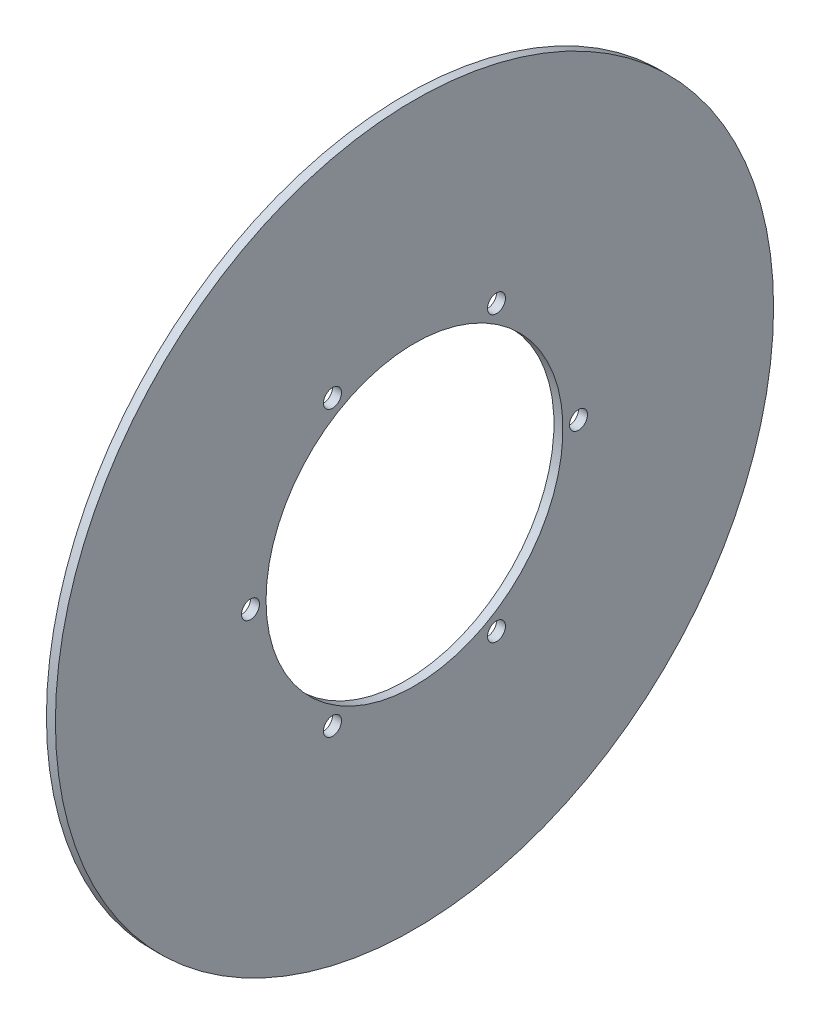
ISO-10303-21;
HEADER;
FILE_DESCRIPTION(('STEP AP214'),'2;1');
FILE_NAME('part.step','',(''),(''),'','','');
FILE_SCHEMA(('AUTOMOTIVE_DESIGN { 1 0 10303 214 1 1 1 1 }'));
ENDSEC;
DATA;
#1=APPLICATION_CONTEXT('core data for automotive mechanical design processes');
#2=APPLICATION_PROTOCOL_DEFINITION('international standard','automotive_design',2000,#1);
#3=PRODUCT_CONTEXT('',#1,'mechanical');
#4=PRODUCT('Part','Part','',(#3));
#5=PRODUCT_RELATED_PRODUCT_CATEGORY('part','',(#4));
#6=PRODUCT_DEFINITION_FORMATION('','',#4);
#7=PRODUCT_DEFINITION_CONTEXT('part definition',#1,'design');
#8=PRODUCT_DEFINITION('design','',#6,#7);
#9=PRODUCT_DEFINITION_SHAPE('','',#8);
#10=(LENGTH_UNIT() NAMED_UNIT(*) SI_UNIT(.MILLI.,.METRE.));
#11=(NAMED_UNIT(*) PLANE_ANGLE_UNIT() SI_UNIT($,.RADIAN.));
#12=(NAMED_UNIT(*) SI_UNIT($,.STERADIAN.) SOLID_ANGLE_UNIT());
#13=UNCERTAINTY_MEASURE_WITH_UNIT(LENGTH_MEASURE(1.E-05),#10,'distance_accuracy_value','');
#14=(GEOMETRIC_REPRESENTATION_CONTEXT(3) GLOBAL_UNCERTAINTY_ASSIGNED_CONTEXT((#13)) GLOBAL_UNIT_ASSIGNED_CONTEXT((#10,
#11,#12)) REPRESENTATION_CONTEXT('',''));
#15=CARTESIAN_POINT('',(0.,0.,0.));
#16=DIRECTION('',(0.,0.,1.));
#17=DIRECTION('',(1.,0.,0.));
#18=AXIS2_PLACEMENT_3D('',#15,#16,#17);
#19=CARTESIAN_POINT('',(-3.175,0.,-58.));
#20=DIRECTION('',(1.,0.,0.));
#21=DIRECTION('',(0.,0.,-1.));
#22=AXIS2_PLACEMENT_3D('',#19,#20,#21);
#23=CYLINDRICAL_SURFACE('',#22,3.175);
#24=CARTESIAN_POINT('',(-3.175,0.,-58.));
#25=DIRECTION('',(-1.,0.,0.));
#26=DIRECTION('',(0.,0.,1.));
#27=AXIS2_PLACEMENT_3D('',#24,#25,#26);
#28=CIRCLE('',#27,3.175);
#29=CARTESIAN_POINT('',(-3.175,0.,-54.825));
#30=VERTEX_POINT('',#29);
#31=EDGE_CURVE('E49',#30,#30,#28,.T.);
#32=ORIENTED_EDGE('',*,*,#31,.T.);
#33=EDGE_LOOP('',(#32));
#34=FACE_BOUND('',#33,.T.);
#35=CARTESIAN_POINT('',(0.,0.,-58.));
#36=DIRECTION('',(-1.,0.,0.));
#37=DIRECTION('',(0.,0.,1.));
#38=AXIS2_PLACEMENT_3D('',#35,#36,#37);
#39=CIRCLE('',#38,3.175);
#40=CARTESIAN_POINT('',(0.,0.,-54.825));
#41=VERTEX_POINT('',#40);
#42=EDGE_CURVE('E75',#41,#41,#39,.T.);
#43=ORIENTED_EDGE('',*,*,#42,.F.);
#44=EDGE_LOOP('',(#43));
#45=FACE_BOUND('',#44,.T.);
#46=ADVANCED_FACE('F41',(#34,#45),#23,.F.);
#47=CARTESIAN_POINT('',(-3.175,0.,58.));
#48=DIRECTION('',(1.,0.,0.));
#49=DIRECTION('',(0.,0.,-1.));
#50=AXIS2_PLACEMENT_3D('',#47,#48,#49);
#51=CYLINDRICAL_SURFACE('',#50,3.175);
#52=CARTESIAN_POINT('',(-3.175,0.,58.));
#53=DIRECTION('',(-1.,0.,0.));
#54=DIRECTION('',(0.,0.,1.));
#55=AXIS2_PLACEMENT_3D('',#52,#53,#54);
#56=CIRCLE('',#55,3.175);
#57=CARTESIAN_POINT('',(-3.175,0.,61.175));
#58=VERTEX_POINT('',#57);
#59=EDGE_CURVE('E54',#58,#58,#56,.T.);
#60=ORIENTED_EDGE('',*,*,#59,.T.);
#61=EDGE_LOOP('',(#60));
#62=FACE_BOUND('',#61,.T.);
#63=CARTESIAN_POINT('',(0.,0.,58.));
#64=DIRECTION('',(-1.,0.,0.));
#65=DIRECTION('',(0.,0.,1.));
#66=AXIS2_PLACEMENT_3D('',#63,#64,#65);
#67=CIRCLE('',#66,3.175);
#68=CARTESIAN_POINT('',(0.,0.,61.175));
#69=VERTEX_POINT('',#68);
#70=EDGE_CURVE('E73',#69,#69,#67,.T.);
#71=ORIENTED_EDGE('',*,*,#70,.F.);
#72=EDGE_LOOP('',(#71));
#73=FACE_BOUND('',#72,.T.);
#74=ADVANCED_FACE('F102',(#62,#73),#51,.F.);
#75=CARTESIAN_POINT('',(-3.175,-50.2294734194974,-29.));
#76=DIRECTION('',(1.,0.,0.));
#77=DIRECTION('',(0.,0.,-1.));
#78=AXIS2_PLACEMENT_3D('',#75,#76,#77);
#79=CYLINDRICAL_SURFACE('',#78,3.175);
#80=CARTESIAN_POINT('',(-3.175,-50.2294734194974,-29.));
#81=DIRECTION('',(-1.,0.,0.));
#82=DIRECTION('',(0.,0.,1.));
#83=AXIS2_PLACEMENT_3D('',#80,#81,#82);
#84=CIRCLE('',#83,3.175);
#85=CARTESIAN_POINT('',(-3.175,-50.2294734194974,-25.825));
#86=VERTEX_POINT('',#85);
#87=EDGE_CURVE('E97',#86,#86,#84,.T.);
#88=ORIENTED_EDGE('',*,*,#87,.T.);
#89=EDGE_LOOP('',(#88));
#90=FACE_BOUND('',#89,.T.);
#91=CARTESIAN_POINT('',(0.,-50.2294734194974,-29.));
#92=DIRECTION('',(-1.,0.,0.));
#93=DIRECTION('',(0.,0.,1.));
#94=AXIS2_PLACEMENT_3D('',#91,#92,#93);
#95=CIRCLE('',#94,3.175);
#96=CARTESIAN_POINT('',(0.,-50.2294734194974,-25.825));
#97=VERTEX_POINT('',#96);
#98=EDGE_CURVE('E70',#97,#97,#95,.T.);
#99=ORIENTED_EDGE('',*,*,#98,.F.);
#100=EDGE_LOOP('',(#99));
#101=FACE_BOUND('',#100,.T.);
#102=ADVANCED_FACE('F120',(#90,#101),#79,.F.);
#103=CARTESIAN_POINT('',(-3.175,-50.2294734194974,29.));
#104=DIRECTION('',(1.,0.,0.));
#105=DIRECTION('',(0.,0.,-1.));
#106=AXIS2_PLACEMENT_3D('',#103,#104,#105);
#107=CYLINDRICAL_SURFACE('',#106,3.175);
#108=CARTESIAN_POINT('',(-3.175,-50.2294734194974,29.));
#109=DIRECTION('',(-1.,0.,0.));
#110=DIRECTION('',(0.,0.,1.));
#111=AXIS2_PLACEMENT_3D('',#108,#109,#110);
#112=CIRCLE('',#111,3.175);
#113=CARTESIAN_POINT('',(-3.175,-50.2294734194974,32.175));
#114=VERTEX_POINT('',#113);
#115=EDGE_CURVE('E94',#114,#114,#112,.T.);
#116=ORIENTED_EDGE('',*,*,#115,.T.);
#117=EDGE_LOOP('',(#116));
#118=FACE_BOUND('',#117,.T.);
#119=CARTESIAN_POINT('',(0.,-50.2294734194974,29.));
#120=DIRECTION('',(-1.,0.,0.));
#121=DIRECTION('',(0.,0.,1.));
#122=AXIS2_PLACEMENT_3D('',#119,#120,#121);
#123=CIRCLE('',#122,3.175);
#124=CARTESIAN_POINT('',(0.,-50.2294734194974,32.175));
#125=VERTEX_POINT('',#124);
#126=EDGE_CURVE('E67',#125,#125,#123,.T.);
#127=ORIENTED_EDGE('',*,*,#126,.F.);
#128=EDGE_LOOP('',(#127));
#129=FACE_BOUND('',#128,.T.);
#130=ADVANCED_FACE('F127',(#118,#129),#107,.F.);
#131=CARTESIAN_POINT('',(-3.175,50.2294734194975,-29.));
#132=DIRECTION('',(1.,0.,0.));
#133=DIRECTION('',(0.,0.,-1.));
#134=AXIS2_PLACEMENT_3D('',#131,#132,#133);
#135=CYLINDRICAL_SURFACE('',#134,3.175);
#136=CARTESIAN_POINT('',(-3.175,50.2294734194975,-29.));
#137=DIRECTION('',(-1.,0.,0.));
#138=DIRECTION('',(0.,0.,1.));
#139=AXIS2_PLACEMENT_3D('',#136,#137,#138);
#140=CIRCLE('',#139,3.175);
#141=CARTESIAN_POINT('',(-3.175,50.2294734194975,-25.825));
#142=VERTEX_POINT('',#141);
#143=EDGE_CURVE('E89',#142,#142,#140,.T.);
#144=ORIENTED_EDGE('',*,*,#143,.T.);
#145=EDGE_LOOP('',(#144));
#146=FACE_BOUND('',#145,.T.);
#147=CARTESIAN_POINT('',(0.,50.2294734194975,-29.));
#148=DIRECTION('',(-1.,0.,0.));
#149=DIRECTION('',(0.,0.,1.));
#150=AXIS2_PLACEMENT_3D('',#147,#148,#149);
#151=CIRCLE('',#150,3.175);
#152=CARTESIAN_POINT('',(0.,50.2294734194975,-25.825));
#153=VERTEX_POINT('',#152);
#154=EDGE_CURVE('E64',#153,#153,#151,.T.);
#155=ORIENTED_EDGE('',*,*,#154,.F.);
#156=EDGE_LOOP('',(#155));
#157=FACE_BOUND('',#156,.T.);
#158=ADVANCED_FACE('F131',(#146,#157),#135,.F.);
#159=CARTESIAN_POINT('',(-3.175,0.,0.));
#160=DIRECTION('',(1.,0.,0.));
#161=DIRECTION('',(0.,0.,-1.));
#162=AXIS2_PLACEMENT_3D('',#159,#160,#161);
#163=CYLINDRICAL_SURFACE('',#162,52.5);
#164=CARTESIAN_POINT('',(-3.175,0.,0.));
#165=DIRECTION('',(-1.,0.,0.));
#166=DIRECTION('',(0.,0.,1.));
#167=AXIS2_PLACEMENT_3D('',#164,#165,#166);
#168=CIRCLE('',#167,52.5);
#169=CARTESIAN_POINT('',(-3.175,0.,52.5));
#170=VERTEX_POINT('',#169);
#171=EDGE_CURVE('E84',#170,#170,#168,.T.);
#172=ORIENTED_EDGE('',*,*,#171,.T.);
#173=EDGE_LOOP('',(#172));
#174=FACE_BOUND('',#173,.T.);
#175=CARTESIAN_POINT('',(0.,0.,0.));
#176=DIRECTION('',(-1.,0.,0.));
#177=DIRECTION('',(0.,0.,1.));
#178=AXIS2_PLACEMENT_3D('',#175,#176,#177);
#179=CIRCLE('',#178,52.5);
#180=CARTESIAN_POINT('',(0.,0.,52.5));
#181=VERTEX_POINT('',#180);
#182=EDGE_CURVE('E61',#181,#181,#179,.T.);
#183=ORIENTED_EDGE('',*,*,#182,.F.);
#184=EDGE_LOOP('',(#183));
#185=FACE_BOUND('',#184,.T.);
#186=ADVANCED_FACE('F134',(#174,#185),#163,.F.);
#187=CARTESIAN_POINT('',(-3.175,0.,0.));
#188=DIRECTION('',(1.,0.,0.));
#189=DIRECTION('',(0.,0.,-1.));
#190=AXIS2_PLACEMENT_3D('',#187,#188,#189);
#191=CYLINDRICAL_SURFACE('',#190,127.);
#192=CARTESIAN_POINT('',(-3.175,0.,0.));
#193=DIRECTION('',(-1.,0.,0.));
#194=DIRECTION('',(0.,0.,1.));
#195=AXIS2_PLACEMENT_3D('',#192,#193,#194);
#196=CIRCLE('',#195,127.);
#197=CARTESIAN_POINT('',(-3.175,0.,127.));
#198=VERTEX_POINT('',#197);
#199=EDGE_CURVE('E80',#198,#198,#196,.T.);
#200=ORIENTED_EDGE('',*,*,#199,.F.);
#201=EDGE_LOOP('',(#200));
#202=FACE_BOUND('',#201,.T.);
#203=CARTESIAN_POINT('',(0.,0.,0.));
#204=DIRECTION('',(-1.,0.,0.));
#205=DIRECTION('',(0.,0.,1.));
#206=AXIS2_PLACEMENT_3D('',#203,#204,#205);
#207=CIRCLE('',#206,127.);
#208=CARTESIAN_POINT('',(0.,0.,127.));
#209=VERTEX_POINT('',#208);
#210=EDGE_CURVE('E58',#209,#209,#207,.T.);
#211=ORIENTED_EDGE('',*,*,#210,.T.);
#212=EDGE_LOOP('',(#211));
#213=FACE_BOUND('',#212,.T.);
#214=ADVANCED_FACE('F43',(#202,#213),#191,.T.);
#215=CARTESIAN_POINT('',(-3.175,50.2294734194975,29.));
#216=DIRECTION('',(1.,0.,0.));
#217=DIRECTION('',(0.,0.,-1.));
#218=AXIS2_PLACEMENT_3D('',#215,#216,#217);
#219=CYLINDRICAL_SURFACE('',#218,3.175);
#220=CARTESIAN_POINT('',(-3.175,50.2294734194975,29.));
#221=DIRECTION('',(-1.,0.,0.));
#222=DIRECTION('',(0.,0.,1.));
#223=AXIS2_PLACEMENT_3D('',#220,#221,#222);
#224=CIRCLE('',#223,3.175);
#225=CARTESIAN_POINT('',(-3.175,50.2294734194975,32.175));
#226=VERTEX_POINT('',#225);
#227=EDGE_CURVE('E10',#226,#226,#224,.T.);
#228=ORIENTED_EDGE('',*,*,#227,.T.);
#229=EDGE_LOOP('',(#228));
#230=FACE_BOUND('',#229,.T.);
#231=CARTESIAN_POINT('',(0.,50.2294734194975,29.));
#232=DIRECTION('',(-1.,0.,0.));
#233=DIRECTION('',(0.,0.,1.));
#234=AXIS2_PLACEMENT_3D('',#231,#232,#233);
#235=CIRCLE('',#234,3.175);
#236=CARTESIAN_POINT('',(0.,50.2294734194975,32.175));
#237=VERTEX_POINT('',#236);
#238=EDGE_CURVE('E45',#237,#237,#235,.T.);
#239=ORIENTED_EDGE('',*,*,#238,.F.);
#240=EDGE_LOOP('',(#239));
#241=FACE_BOUND('',#240,.T.);
#242=ADVANCED_FACE('F109',(#230,#241),#219,.F.);
#243=CARTESIAN_POINT('',(-3.175,0.,0.));
#244=DIRECTION('',(-1.,0.,0.));
#245=DIRECTION('',(0.,0.,1.));
#246=AXIS2_PLACEMENT_3D('',#243,#244,#245);
#247=PLANE('',#246);
#248=ORIENTED_EDGE('',*,*,#199,.T.);
#249=EDGE_LOOP('',(#248));
#250=FACE_BOUND('',#249,.T.);
#251=ORIENTED_EDGE('',*,*,#171,.F.);
#252=EDGE_LOOP('',(#251));
#253=FACE_BOUND('',#252,.T.);
#254=ORIENTED_EDGE('',*,*,#143,.F.);
#255=EDGE_LOOP('',(#254));
#256=FACE_BOUND('',#255,.T.);
#257=ORIENTED_EDGE('',*,*,#115,.F.);
#258=EDGE_LOOP('',(#257));
#259=FACE_BOUND('',#258,.T.);
#260=ORIENTED_EDGE('',*,*,#87,.F.);
#261=EDGE_LOOP('',(#260));
#262=FACE_BOUND('',#261,.T.);
#263=ORIENTED_EDGE('',*,*,#59,.F.);
#264=EDGE_LOOP('',(#263));
#265=FACE_BOUND('',#264,.T.);
#266=ORIENTED_EDGE('',*,*,#31,.F.);
#267=EDGE_LOOP('',(#266));
#268=FACE_BOUND('',#267,.T.);
#269=ORIENTED_EDGE('',*,*,#227,.F.);
#270=EDGE_LOOP('',(#269));
#271=FACE_BOUND('',#270,.T.);
#272=ADVANCED_FACE('F105',(#250,#253,#256,#259,#262,#265,#268,#271),#247,.T.);
#273=CARTESIAN_POINT('',(0.,0.,0.));
#274=DIRECTION('',(-1.,0.,0.));
#275=DIRECTION('',(0.,0.,1.));
#276=AXIS2_PLACEMENT_3D('',#273,#274,#275);
#277=PLANE('',#276);
#278=ORIENTED_EDGE('',*,*,#210,.F.);
#279=EDGE_LOOP('',(#278));
#280=FACE_BOUND('',#279,.T.);
#281=ORIENTED_EDGE('',*,*,#182,.T.);
#282=EDGE_LOOP('',(#281));
#283=FACE_BOUND('',#282,.T.);
#284=ORIENTED_EDGE('',*,*,#154,.T.);
#285=EDGE_LOOP('',(#284));
#286=FACE_BOUND('',#285,.T.);
#287=ORIENTED_EDGE('',*,*,#126,.T.);
#288=EDGE_LOOP('',(#287));
#289=FACE_BOUND('',#288,.T.);
#290=ORIENTED_EDGE('',*,*,#98,.T.);
#291=EDGE_LOOP('',(#290));
#292=FACE_BOUND('',#291,.T.);
#293=ORIENTED_EDGE('',*,*,#70,.T.);
#294=EDGE_LOOP('',(#293));
#295=FACE_BOUND('',#294,.T.);
#296=ORIENTED_EDGE('',*,*,#42,.T.);
#297=EDGE_LOOP('',(#296));
#298=FACE_BOUND('',#297,.T.);
#299=ORIENTED_EDGE('',*,*,#238,.T.);
#300=EDGE_LOOP('',(#299));
#301=FACE_BOUND('',#300,.T.);
#302=ADVANCED_FACE('F108',(#280,#283,#286,#289,#292,#295,#298,#301),#277,.F.);
#303=CLOSED_SHELL('',(#46,#74,#102,#130,#158,#186,#214,#242,#272,#302));
#304=MANIFOLD_SOLID_BREP('B2',#303);
#305=ADVANCED_BREP_SHAPE_REPRESENTATION('',(#18,#304),#14);
#306=SHAPE_DEFINITION_REPRESENTATION(#9,#305);
ENDSEC;
END-ISO-10303-21;
